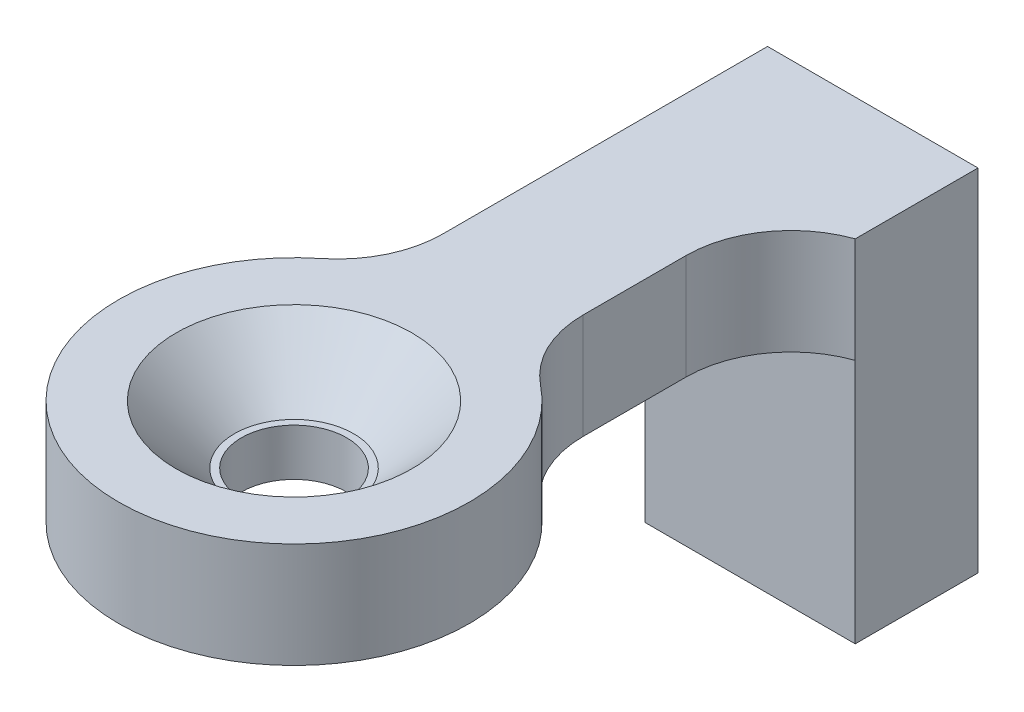
ISO-10303-21;
HEADER;
FILE_DESCRIPTION(('STEP AP214'),'2;1');
FILE_NAME('part.step','',(''),(''),'','','');
FILE_SCHEMA(('AUTOMOTIVE_DESIGN { 1 0 10303 214 1 1 1 1 }'));
ENDSEC;
DATA;
#1=APPLICATION_CONTEXT('core data for automotive mechanical design processes');
#2=APPLICATION_PROTOCOL_DEFINITION('international standard','automotive_design',2000,#1);
#3=PRODUCT_CONTEXT('',#1,'mechanical');
#4=PRODUCT('Part','Part','',(#3));
#5=PRODUCT_RELATED_PRODUCT_CATEGORY('part','',(#4));
#6=PRODUCT_DEFINITION_FORMATION('','',#4);
#7=PRODUCT_DEFINITION_CONTEXT('part definition',#1,'design');
#8=PRODUCT_DEFINITION('design','',#6,#7);
#9=PRODUCT_DEFINITION_SHAPE('','',#8);
#10=(LENGTH_UNIT() NAMED_UNIT(*) SI_UNIT(.MILLI.,.METRE.));
#11=(NAMED_UNIT(*) PLANE_ANGLE_UNIT() SI_UNIT($,.RADIAN.));
#12=(NAMED_UNIT(*) SI_UNIT($,.STERADIAN.) SOLID_ANGLE_UNIT());
#13=UNCERTAINTY_MEASURE_WITH_UNIT(LENGTH_MEASURE(1.E-05),#10,'distance_accuracy_value','');
#14=(GEOMETRIC_REPRESENTATION_CONTEXT(3) GLOBAL_UNCERTAINTY_ASSIGNED_CONTEXT((#13)) GLOBAL_UNIT_ASSIGNED_CONTEXT((#10,
#11,#12)) REPRESENTATION_CONTEXT('',''));
#15=CARTESIAN_POINT('',(0.,0.,0.));
#16=DIRECTION('',(0.,0.,1.));
#17=DIRECTION('',(1.,0.,0.));
#18=AXIS2_PLACEMENT_3D('',#15,#16,#17);
#19=CARTESIAN_POINT('',(0.,3.,0.));
#20=DIRECTION('',(0.,-1.,0.));
#21=DIRECTION('',(0.,0.,-1.));
#22=AXIS2_PLACEMENT_3D('',#19,#20,#21);
#23=PLANE('',#22);
#24=CARTESIAN_POINT('',(2.,3.,-2.));
#25=DIRECTION('',(0.,1.,0.));
#26=DIRECTION('',(0.,0.,1.));
#27=AXIS2_PLACEMENT_3D('',#24,#25,#26);
#28=CIRCLE('',#27,3.36);
#29=CARTESIAN_POINT('',(2.,3.,1.36));
#30=VERTEX_POINT('',#29);
#31=EDGE_CURVE('E171',#30,#30,#28,.T.);
#32=ORIENTED_EDGE('',*,*,#31,.F.);
#33=EDGE_LOOP('',(#32));
#34=FACE_BOUND('',#33,.T.);
#35=DIRECTION('',(0.,0.,1.));
#36=VECTOR('',#35,1.);
#37=CARTESIAN_POINT('',(0.,3.,0.));
#38=LINE('',#37,#36);
#39=CARTESIAN_POINT('',(0.,3.,-17.5));
#40=VERTEX_POINT('',#39);
#41=CARTESIAN_POINT('',(0.,3.,-8.2449979983984));
#42=VERTEX_POINT('',#41);
#43=EDGE_CURVE('E156',#40,#42,#38,.T.);
#44=ORIENTED_EDGE('',*,*,#43,.T.);
#45=CARTESIAN_POINT('',(-3.,3.,-8.2449979983984));
#46=DIRECTION('',(0.,-1.,0.));
#47=DIRECTION('',(0.,0.,-1.));
#48=AXIS2_PLACEMENT_3D('',#45,#46,#47);
#49=CIRCLE('',#48,3.);
#50=CARTESIAN_POINT('',(-1.125,3.,-5.903123748999));
#51=VERTEX_POINT('',#50);
#52=EDGE_CURVE('E43',#42,#51,#49,.T.);
#53=ORIENTED_EDGE('',*,*,#52,.T.);
#54=CARTESIAN_POINT('',(2.,3.,-2.));
#55=DIRECTION('',(0.,1.,0.));
#56=DIRECTION('',(0.,0.,1.));
#57=AXIS2_PLACEMENT_3D('',#54,#55,#56);
#58=CIRCLE('',#57,5.);
#59=CARTESIAN_POINT('',(5.125,3.,-5.903123748999));
#60=VERTEX_POINT('',#59);
#61=EDGE_CURVE('E139',#51,#60,#58,.T.);
#62=ORIENTED_EDGE('',*,*,#61,.T.);
#63=CARTESIAN_POINT('',(7.,3.,-8.2449979983984));
#64=DIRECTION('',(0.,-1.,0.));
#65=DIRECTION('',(0.,0.,-1.));
#66=AXIS2_PLACEMENT_3D('',#63,#64,#65);
#67=CIRCLE('',#66,3.);
#68=CARTESIAN_POINT('',(4.,3.,-8.2449979983984));
#69=VERTEX_POINT('',#68);
#70=EDGE_CURVE('E188',#60,#69,#67,.T.);
#71=ORIENTED_EDGE('',*,*,#70,.T.);
#72=DIRECTION('',(0.,0.,-1.));
#73=VECTOR('',#72,1.);
#74=CARTESIAN_POINT('',(4.,3.,0.));
#75=LINE('',#74,#73);
#76=CARTESIAN_POINT('',(4.,3.,-11.1715728752538));
#77=VERTEX_POINT('',#76);
#78=EDGE_CURVE('E159',#69,#77,#75,.T.);
#79=ORIENTED_EDGE('',*,*,#78,.T.);
#80=CARTESIAN_POINT('',(7.,3.,-11.1715728752538));
#81=DIRECTION('',(0.,-1.,0.));
#82=DIRECTION('',(0.,0.,-1.));
#83=AXIS2_PLACEMENT_3D('',#80,#81,#82);
#84=CIRCLE('',#83,3.);
#85=CARTESIAN_POINT('',(6.,3.,-14.));
#86=VERTEX_POINT('',#85);
#87=EDGE_CURVE('E184',#77,#86,#84,.T.);
#88=ORIENTED_EDGE('',*,*,#87,.T.);
#89=DIRECTION('',(0.,0.,-1.));
#90=VECTOR('',#89,1.);
#91=CARTESIAN_POINT('',(6.,3.,-14.));
#92=LINE('',#91,#90);
#93=CARTESIAN_POINT('',(6.,3.,-17.5));
#94=VERTEX_POINT('',#93);
#95=EDGE_CURVE('E136',#86,#94,#92,.T.);
#96=ORIENTED_EDGE('',*,*,#95,.T.);
#97=DIRECTION('',(-1.,0.,0.));
#98=VECTOR('',#97,1.);
#99=CARTESIAN_POINT('',(0.,3.,-17.5));
#100=LINE('',#99,#98);
#101=EDGE_CURVE('E133',#94,#40,#100,.T.);
#102=ORIENTED_EDGE('',*,*,#101,.T.);
#103=EDGE_LOOP('',(#44,#53,#62,#71,#79,#88,#96,#102));
#104=FACE_BOUND('',#103,.T.);
#105=ADVANCED_FACE('F35',(#34,#104),#23,.F.);
#106=CARTESIAN_POINT('',(0.,0.,0.));
#107=DIRECTION('',(0.,-1.,0.));
#108=DIRECTION('',(0.,0.,-1.));
#109=AXIS2_PLACEMENT_3D('',#106,#107,#108);
#110=PLANE('',#109);
#111=DIRECTION('',(0.,0.,-1.));
#112=VECTOR('',#111,1.);
#113=CARTESIAN_POINT('',(4.,0.,0.));
#114=LINE('',#113,#112);
#115=CARTESIAN_POINT('',(4.,0.,-8.2449979983984));
#116=VERTEX_POINT('',#115);
#117=CARTESIAN_POINT('',(4.,0.,-11.1715728752538));
#118=VERTEX_POINT('',#117);
#119=EDGE_CURVE('E164',#116,#118,#114,.T.);
#120=ORIENTED_EDGE('',*,*,#119,.F.);
#121=CARTESIAN_POINT('',(7.,0.,-8.2449979983984));
#122=DIRECTION('',(0.,-1.,0.));
#123=DIRECTION('',(0.,0.,-1.));
#124=AXIS2_PLACEMENT_3D('',#121,#122,#123);
#125=CIRCLE('',#124,3.);
#126=CARTESIAN_POINT('',(5.125,0.,-5.903123748999));
#127=VERTEX_POINT('',#126);
#128=EDGE_CURVE('E186',#116,#127,#125,.F.);
#129=ORIENTED_EDGE('',*,*,#128,.T.);
#130=CARTESIAN_POINT('',(2.,0.,-2.));
#131=DIRECTION('',(0.,1.,0.));
#132=DIRECTION('',(0.,0.,1.));
#133=AXIS2_PLACEMENT_3D('',#130,#131,#132);
#134=CIRCLE('',#133,5.);
#135=CARTESIAN_POINT('',(-1.125,0.,-5.903123748999));
#136=VERTEX_POINT('',#135);
#137=EDGE_CURVE('E145',#136,#127,#134,.T.);
#138=ORIENTED_EDGE('',*,*,#137,.F.);
#139=CARTESIAN_POINT('',(-3.,0.,-8.2449979983984));
#140=DIRECTION('',(0.,-1.,0.));
#141=DIRECTION('',(0.,0.,-1.));
#142=AXIS2_PLACEMENT_3D('',#139,#140,#141);
#143=CIRCLE('',#142,3.);
#144=CARTESIAN_POINT('',(0.,0.,-8.2449979983984));
#145=VERTEX_POINT('',#144);
#146=EDGE_CURVE('E11',#136,#145,#143,.F.);
#147=ORIENTED_EDGE('',*,*,#146,.T.);
#148=DIRECTION('',(0.,0.,1.));
#149=VECTOR('',#148,1.);
#150=CARTESIAN_POINT('',(0.,0.,0.));
#151=LINE('',#150,#149);
#152=CARTESIAN_POINT('',(0.,0.,-14.));
#153=VERTEX_POINT('',#152);
#154=EDGE_CURVE('E155',#153,#145,#151,.T.);
#155=ORIENTED_EDGE('',*,*,#154,.F.);
#156=DIRECTION('',(-1.,0.,0.));
#157=VECTOR('',#156,1.);
#158=CARTESIAN_POINT('',(0.,0.,-14.));
#159=LINE('',#158,#157);
#160=CARTESIAN_POINT('',(6.,0.,-14.));
#161=VERTEX_POINT('',#160);
#162=EDGE_CURVE('E114',#161,#153,#159,.T.);
#163=ORIENTED_EDGE('',*,*,#162,.F.);
#164=CARTESIAN_POINT('',(7.,0.,-11.1715728752538));
#165=DIRECTION('',(0.,-1.,0.));
#166=DIRECTION('',(0.,0.,-1.));
#167=AXIS2_PLACEMENT_3D('',#164,#165,#166);
#168=CIRCLE('',#167,3.);
#169=EDGE_CURVE('E182',#161,#118,#168,.F.);
#170=ORIENTED_EDGE('',*,*,#169,.T.);
#171=EDGE_LOOP('',(#120,#129,#138,#147,#155,#163,#170));
#172=FACE_BOUND('',#171,.T.);
#173=CARTESIAN_POINT('',(2.,0.,-2.));
#174=DIRECTION('',(0.,1.,0.));
#175=DIRECTION('',(0.,0.,1.));
#176=AXIS2_PLACEMENT_3D('',#173,#174,#175);
#177=CIRCLE('',#176,1.5);
#178=CARTESIAN_POINT('',(2.,0.,-0.499999999999999));
#179=VERTEX_POINT('',#178);
#180=EDGE_CURVE('E148',#179,#179,#177,.T.);
#181=ORIENTED_EDGE('',*,*,#180,.T.);
#182=EDGE_LOOP('',(#181));
#183=FACE_BOUND('',#182,.T.);
#184=ADVANCED_FACE('F198',(#172,#183),#110,.T.);
#185=CARTESIAN_POINT('',(0.,3.,0.));
#186=DIRECTION('',(1.,0.,0.));
#187=DIRECTION('',(0.,0.,-1.));
#188=AXIS2_PLACEMENT_3D('',#185,#186,#187);
#189=PLANE('',#188);
#190=ORIENTED_EDGE('',*,*,#154,.T.);
#191=DIRECTION('',(0.,1.,0.));
#192=VECTOR('',#191,1.);
#193=CARTESIAN_POINT('',(0.,3.,-8.2449979983984));
#194=LINE('',#193,#192);
#195=EDGE_CURVE('E180',#145,#42,#194,.T.);
#196=ORIENTED_EDGE('',*,*,#195,.T.);
#197=ORIENTED_EDGE('',*,*,#43,.F.);
#198=DIRECTION('',(0.,1.,0.));
#199=VECTOR('',#198,1.);
#200=CARTESIAN_POINT('',(0.,-7.,-17.5));
#201=LINE('',#200,#199);
#202=CARTESIAN_POINT('',(0.,-7.,-17.5));
#203=VERTEX_POINT('',#202);
#204=EDGE_CURVE('E132',#203,#40,#201,.T.);
#205=ORIENTED_EDGE('',*,*,#204,.F.);
#206=DIRECTION('',(0.,0.,1.));
#207=VECTOR('',#206,1.);
#208=CARTESIAN_POINT('',(0.,-7.,-14.));
#209=LINE('',#208,#207);
#210=CARTESIAN_POINT('',(0.,-7.,-14.));
#211=VERTEX_POINT('',#210);
#212=EDGE_CURVE('E125',#203,#211,#209,.T.);
#213=ORIENTED_EDGE('',*,*,#212,.T.);
#214=DIRECTION('',(0.,1.,0.));
#215=VECTOR('',#214,1.);
#216=CARTESIAN_POINT('',(0.,-7.,-14.));
#217=LINE('',#216,#215);
#218=EDGE_CURVE('E109',#211,#153,#217,.T.);
#219=ORIENTED_EDGE('',*,*,#218,.T.);
#220=EDGE_LOOP('',(#190,#196,#197,#205,#213,#219));
#221=FACE_BOUND('',#220,.T.);
#222=ADVANCED_FACE('F130',(#221),#189,.F.);
#223=CARTESIAN_POINT('',(4.,3.,0.));
#224=DIRECTION('',(-1.,0.,0.));
#225=DIRECTION('',(0.,0.,1.));
#226=AXIS2_PLACEMENT_3D('',#223,#224,#225);
#227=PLANE('',#226);
#228=ORIENTED_EDGE('',*,*,#119,.T.);
#229=DIRECTION('',(0.,1.,0.));
#230=VECTOR('',#229,1.);
#231=CARTESIAN_POINT('',(4.,3.,-11.1715728752538));
#232=LINE('',#231,#230);
#233=EDGE_CURVE('E174',#118,#77,#232,.T.);
#234=ORIENTED_EDGE('',*,*,#233,.T.);
#235=ORIENTED_EDGE('',*,*,#78,.F.);
#236=DIRECTION('',(0.,1.,0.));
#237=VECTOR('',#236,1.);
#238=CARTESIAN_POINT('',(4.,3.,-8.2449979983984));
#239=LINE('',#238,#237);
#240=EDGE_CURVE('E162',#69,#116,#239,.F.);
#241=ORIENTED_EDGE('',*,*,#240,.T.);
#242=EDGE_LOOP('',(#228,#234,#235,#241));
#243=FACE_BOUND('',#242,.T.);
#244=ADVANCED_FACE('F223',(#243),#227,.F.);
#245=CARTESIAN_POINT('',(2.,3.,-2.));
#246=DIRECTION('',(0.,-1.,0.));
#247=DIRECTION('',(0.,0.,-1.));
#248=AXIS2_PLACEMENT_3D('',#245,#246,#247);
#249=CYLINDRICAL_SURFACE('',#248,1.5);
#250=CARTESIAN_POINT('',(2.,1.34,-2.));
#251=DIRECTION('',(0.,-1.,0.));
#252=DIRECTION('',(0.,0.,-1.));
#253=AXIS2_PLACEMENT_3D('',#250,#251,#252);
#254=CIRCLE('',#253,1.5);
#255=CARTESIAN_POINT('',(2.,1.34,-3.5));
#256=VERTEX_POINT('',#255);
#257=EDGE_CURVE('E168',#256,#256,#254,.T.);
#258=ORIENTED_EDGE('',*,*,#257,.F.);
#259=EDGE_LOOP('',(#258));
#260=FACE_BOUND('',#259,.T.);
#261=ORIENTED_EDGE('',*,*,#180,.F.);
#262=EDGE_LOOP('',(#261));
#263=FACE_BOUND('',#262,.T.);
#264=ADVANCED_FACE('F214',(#260,#263),#249,.F.);
#265=CARTESIAN_POINT('',(0.,-7.,-17.5));
#266=DIRECTION('',(0.,0.,-1.));
#267=DIRECTION('',(-1.,0.,0.));
#268=AXIS2_PLACEMENT_3D('',#265,#266,#267);
#269=PLANE('',#268);
#270=ORIENTED_EDGE('',*,*,#101,.F.);
#271=DIRECTION('',(0.,1.,0.));
#272=VECTOR('',#271,1.);
#273=CARTESIAN_POINT('',(6.,-7.,-17.5));
#274=LINE('',#273,#272);
#275=CARTESIAN_POINT('',(6.,-7.,-17.5));
#276=VERTEX_POINT('',#275);
#277=EDGE_CURVE('E149',#276,#94,#274,.T.);
#278=ORIENTED_EDGE('',*,*,#277,.F.);
#279=DIRECTION('',(-1.,0.,0.));
#280=VECTOR('',#279,1.);
#281=CARTESIAN_POINT('',(0.,-7.,-17.5));
#282=LINE('',#281,#280);
#283=EDGE_CURVE('E118',#276,#203,#282,.T.);
#284=ORIENTED_EDGE('',*,*,#283,.T.);
#285=ORIENTED_EDGE('',*,*,#204,.T.);
#286=EDGE_LOOP('',(#270,#278,#284,#285));
#287=FACE_BOUND('',#286,.T.);
#288=ADVANCED_FACE('F212',(#287),#269,.T.);
#289=CARTESIAN_POINT('',(6.,-7.,-14.));
#290=DIRECTION('',(1.,0.,0.));
#291=DIRECTION('',(0.,0.,-1.));
#292=AXIS2_PLACEMENT_3D('',#289,#290,#291);
#293=PLANE('',#292);
#294=ORIENTED_EDGE('',*,*,#95,.F.);
#295=DIRECTION('',(0.,1.,0.));
#296=VECTOR('',#295,1.);
#297=CARTESIAN_POINT('',(6.,-7.,-14.));
#298=LINE('',#297,#296);
#299=EDGE_CURVE('E117',#161,#86,#298,.T.);
#300=ORIENTED_EDGE('',*,*,#299,.F.);
#301=CARTESIAN_POINT('',(6.,-7.,-14.));
#302=VERTEX_POINT('',#301);
#303=EDGE_CURVE('E151',#302,#161,#298,.T.);
#304=ORIENTED_EDGE('',*,*,#303,.F.);
#305=DIRECTION('',(0.,0.,-1.));
#306=VECTOR('',#305,1.);
#307=CARTESIAN_POINT('',(6.,-7.,-14.));
#308=LINE('',#307,#306);
#309=EDGE_CURVE('E128',#302,#276,#308,.T.);
#310=ORIENTED_EDGE('',*,*,#309,.T.);
#311=ORIENTED_EDGE('',*,*,#277,.T.);
#312=EDGE_LOOP('',(#294,#300,#304,#310,#311));
#313=FACE_BOUND('',#312,.T.);
#314=ADVANCED_FACE('F209',(#313),#293,.T.);
#315=CARTESIAN_POINT('',(0.,-7.,-14.));
#316=DIRECTION('',(0.,0.,1.));
#317=DIRECTION('',(1.,0.,0.));
#318=AXIS2_PLACEMENT_3D('',#315,#316,#317);
#319=PLANE('',#318);
#320=ORIENTED_EDGE('',*,*,#303,.T.);
#321=ORIENTED_EDGE('',*,*,#162,.T.);
#322=ORIENTED_EDGE('',*,*,#218,.F.);
#323=DIRECTION('',(1.,0.,0.));
#324=VECTOR('',#323,1.);
#325=CARTESIAN_POINT('',(0.,-7.,-14.));
#326=LINE('',#325,#324);
#327=EDGE_CURVE('E113',#211,#302,#326,.T.);
#328=ORIENTED_EDGE('',*,*,#327,.T.);
#329=EDGE_LOOP('',(#320,#321,#322,#328));
#330=FACE_BOUND('',#329,.T.);
#331=ADVANCED_FACE('F112',(#330),#319,.T.);
#332=CARTESIAN_POINT('',(0.,-7.,0.));
#333=DIRECTION('',(0.,-1.,0.));
#334=DIRECTION('',(0.,0.,-1.));
#335=AXIS2_PLACEMENT_3D('',#332,#333,#334);
#336=PLANE('',#335);
#337=ORIENTED_EDGE('',*,*,#212,.F.);
#338=ORIENTED_EDGE('',*,*,#283,.F.);
#339=ORIENTED_EDGE('',*,*,#309,.F.);
#340=ORIENTED_EDGE('',*,*,#327,.F.);
#341=EDGE_LOOP('',(#337,#338,#339,#340));
#342=FACE_BOUND('',#341,.T.);
#343=ADVANCED_FACE('F123',(#342),#336,.T.);
#344=CARTESIAN_POINT('',(2.,0.,-2.));
#345=DIRECTION('',(0.,1.,0.));
#346=DIRECTION('',(0.,0.,1.));
#347=AXIS2_PLACEMENT_3D('',#344,#345,#346);
#348=CYLINDRICAL_SURFACE('',#347,5.);
#349=ORIENTED_EDGE('',*,*,#137,.T.);
#350=DIRECTION('',(0.,1.,0.));
#351=VECTOR('',#350,1.);
#352=CARTESIAN_POINT('',(5.125,0.,-5.903123748999));
#353=LINE('',#352,#351);
#354=EDGE_CURVE('E178',#127,#60,#353,.T.);
#355=ORIENTED_EDGE('',*,*,#354,.T.);
#356=ORIENTED_EDGE('',*,*,#61,.F.);
#357=DIRECTION('',(0.,1.,0.));
#358=VECTOR('',#357,1.);
#359=CARTESIAN_POINT('',(-1.125,0.,-5.903123748999));
#360=LINE('',#359,#358);
#361=EDGE_CURVE('E176',#51,#136,#360,.F.);
#362=ORIENTED_EDGE('',*,*,#361,.T.);
#363=EDGE_LOOP('',(#349,#355,#356,#362));
#364=FACE_BOUND('',#363,.T.);
#365=ADVANCED_FACE('F195',(#364),#348,.T.);
#366=CARTESIAN_POINT('',(2.,3.,-2.));
#367=DIRECTION('',(0.,1.,0.));
#368=DIRECTION('',(0.,0.,1.));
#369=AXIS2_PLACEMENT_3D('',#366,#367,#368);
#370=CONICAL_SURFACE('',#369,3.36,0.785398163397448);
#371=CARTESIAN_POINT('',(2.,1.34,-2.));
#372=DIRECTION('',(0.,1.,0.));
#373=DIRECTION('',(0.,0.,1.));
#374=AXIS2_PLACEMENT_3D('',#371,#372,#373);
#375=CIRCLE('',#374,1.7);
#376=CARTESIAN_POINT('',(2.,1.34,-0.3));
#377=VERTEX_POINT('',#376);
#378=EDGE_CURVE('E256',#377,#377,#375,.T.);
#379=ORIENTED_EDGE('',*,*,#378,.F.);
#380=EDGE_LOOP('',(#379));
#381=FACE_BOUND('',#380,.T.);
#382=ORIENTED_EDGE('',*,*,#31,.T.);
#383=EDGE_LOOP('',(#382));
#384=FACE_BOUND('',#383,.T.);
#385=ADVANCED_FACE('F261',(#381,#384),#370,.F.);
#386=CARTESIAN_POINT('',(3.7,1.34,-2.));
#387=DIRECTION('',(0.,-1.,0.));
#388=DIRECTION('',(0.,0.,-1.));
#389=AXIS2_PLACEMENT_3D('',#386,#387,#388);
#390=PLANE('',#389);
#391=ORIENTED_EDGE('',*,*,#257,.T.);
#392=EDGE_LOOP('',(#391));
#393=FACE_BOUND('',#392,.T.);
#394=ORIENTED_EDGE('',*,*,#378,.T.);
#395=EDGE_LOOP('',(#394));
#396=FACE_BOUND('',#395,.T.);
#397=ADVANCED_FACE('F245',(#393,#396),#390,.F.);
#398=CARTESIAN_POINT('',(7.,-7.,-11.1715728752538));
#399=DIRECTION('',(0.,1.,0.));
#400=DIRECTION('',(0.,0.,1.));
#401=AXIS2_PLACEMENT_3D('',#398,#399,#400);
#402=CYLINDRICAL_SURFACE('',#401,3.);
#403=ORIENTED_EDGE('',*,*,#87,.F.);
#404=ORIENTED_EDGE('',*,*,#233,.F.);
#405=ORIENTED_EDGE('',*,*,#169,.F.);
#406=ORIENTED_EDGE('',*,*,#299,.T.);
#407=EDGE_LOOP('',(#403,#404,#405,#406));
#408=FACE_BOUND('',#407,.T.);
#409=ADVANCED_FACE('F206',(#408),#402,.F.);
#410=CARTESIAN_POINT('',(7.,0.,-8.2449979983984));
#411=DIRECTION('',(0.,1.,0.));
#412=DIRECTION('',(0.,0.,1.));
#413=AXIS2_PLACEMENT_3D('',#410,#411,#412);
#414=CYLINDRICAL_SURFACE('',#413,3.);
#415=ORIENTED_EDGE('',*,*,#70,.F.);
#416=ORIENTED_EDGE('',*,*,#354,.F.);
#417=ORIENTED_EDGE('',*,*,#128,.F.);
#418=ORIENTED_EDGE('',*,*,#240,.F.);
#419=EDGE_LOOP('',(#415,#416,#417,#418));
#420=FACE_BOUND('',#419,.T.);
#421=ADVANCED_FACE('F244',(#420),#414,.F.);
#422=CARTESIAN_POINT('',(-3.,0.,-8.2449979983984));
#423=DIRECTION('',(0.,1.,0.));
#424=DIRECTION('',(0.,0.,1.));
#425=AXIS2_PLACEMENT_3D('',#422,#423,#424);
#426=CYLINDRICAL_SURFACE('',#425,3.);
#427=ORIENTED_EDGE('',*,*,#146,.F.);
#428=ORIENTED_EDGE('',*,*,#361,.F.);
#429=ORIENTED_EDGE('',*,*,#52,.F.);
#430=ORIENTED_EDGE('',*,*,#195,.F.);
#431=EDGE_LOOP('',(#427,#428,#429,#430));
#432=FACE_BOUND('',#431,.T.);
#433=ADVANCED_FACE('F37',(#432),#426,.F.);
#434=CLOSED_SHELL('',(#105,#184,#222,#244,#264,#288,#314,#331,#343,#365,#385,#397,#409,#421,#433));
#435=MANIFOLD_SOLID_BREP('B2',#434);
#436=ADVANCED_BREP_SHAPE_REPRESENTATION('',(#18,#435),#14);
#437=SHAPE_DEFINITION_REPRESENTATION(#9,#436);
ENDSEC;
END-ISO-10303-21;
